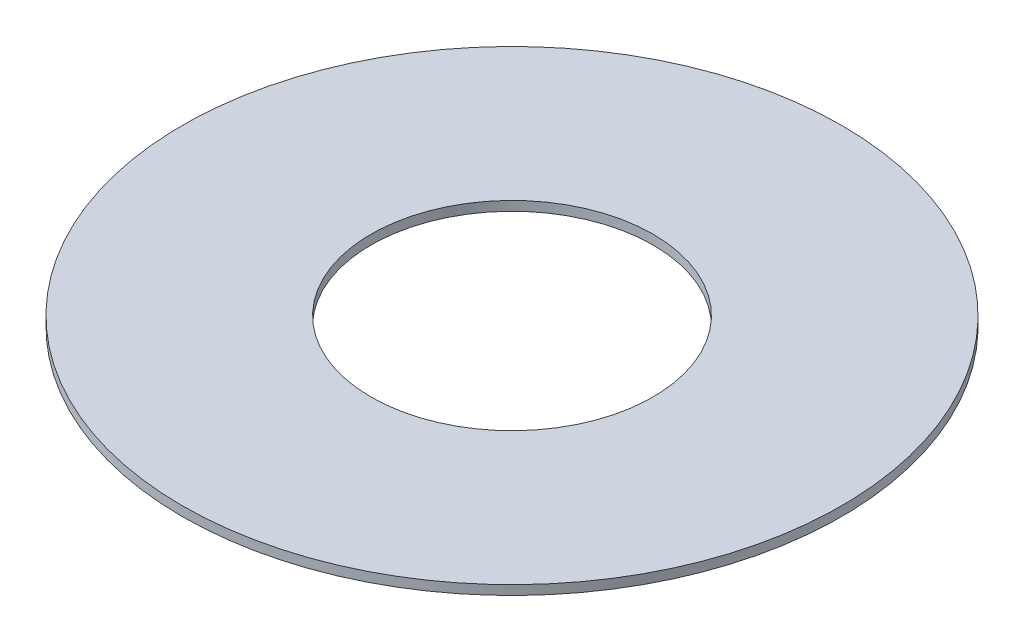
ISO-10303-21;
HEADER;
FILE_DESCRIPTION(('STEP AP214'),'2;1');
FILE_NAME('part.step','',(''),(''),'','','');
FILE_SCHEMA(('AUTOMOTIVE_DESIGN { 1 0 10303 214 1 1 1 1 }'));
ENDSEC;
DATA;
#1=APPLICATION_CONTEXT('core data for automotive mechanical design processes');
#2=APPLICATION_PROTOCOL_DEFINITION('international standard','automotive_design',2000,#1);
#3=PRODUCT_CONTEXT('',#1,'mechanical');
#4=PRODUCT('Part','Part','',(#3));
#5=PRODUCT_RELATED_PRODUCT_CATEGORY('part','',(#4));
#6=PRODUCT_DEFINITION_FORMATION('','',#4);
#7=PRODUCT_DEFINITION_CONTEXT('part definition',#1,'design');
#8=PRODUCT_DEFINITION('design','',#6,#7);
#9=PRODUCT_DEFINITION_SHAPE('','',#8);
#10=(LENGTH_UNIT() NAMED_UNIT(*) SI_UNIT(.MILLI.,.METRE.));
#11=(NAMED_UNIT(*) PLANE_ANGLE_UNIT() SI_UNIT($,.RADIAN.));
#12=(NAMED_UNIT(*) SI_UNIT($,.STERADIAN.) SOLID_ANGLE_UNIT());
#13=UNCERTAINTY_MEASURE_WITH_UNIT(LENGTH_MEASURE(1.E-05),#10,'distance_accuracy_value','');
#14=(GEOMETRIC_REPRESENTATION_CONTEXT(3) GLOBAL_UNCERTAINTY_ASSIGNED_CONTEXT((#13)) GLOBAL_UNIT_ASSIGNED_CONTEXT((#10,
#11,#12)) REPRESENTATION_CONTEXT('',''));
#15=CARTESIAN_POINT('',(0.,0.,0.));
#16=DIRECTION('',(0.,0.,1.));
#17=DIRECTION('',(1.,0.,0.));
#18=AXIS2_PLACEMENT_3D('',#15,#16,#17);
#19=CARTESIAN_POINT('',(0.,0.1,0.));
#20=DIRECTION('',(0.,1.,0.));
#21=DIRECTION('',(0.,0.,1.));
#22=AXIS2_PLACEMENT_3D('',#19,#20,#21);
#23=PLANE('',#22);
#24=CARTESIAN_POINT('',(0.,0.1,0.));
#25=DIRECTION('',(0.,1.,0.));
#26=DIRECTION('',(0.,0.,1.));
#27=AXIS2_PLACEMENT_3D('',#24,#25,#26);
#28=CIRCLE('',#27,3.505);
#29=CARTESIAN_POINT('',(0.,0.1,3.505));
#30=VERTEX_POINT('',#29);
#31=EDGE_CURVE('E10',#30,#30,#28,.T.);
#32=ORIENTED_EDGE('',*,*,#31,.T.);
#33=EDGE_LOOP('',(#32));
#34=FACE_BOUND('',#33,.T.);
#35=CARTESIAN_POINT('',(0.,0.1,0.));
#36=DIRECTION('',(0.,1.,0.));
#37=DIRECTION('',(0.,0.,1.));
#38=AXIS2_PLACEMENT_3D('',#35,#36,#37);
#39=CIRCLE('',#38,1.5);
#40=CARTESIAN_POINT('',(0.,0.1,1.5));
#41=VERTEX_POINT('',#40);
#42=EDGE_CURVE('E44',#41,#41,#39,.T.);
#43=ORIENTED_EDGE('',*,*,#42,.F.);
#44=EDGE_LOOP('',(#43));
#45=FACE_BOUND('',#44,.T.);
#46=ADVANCED_FACE('F33',(#34,#45),#23,.T.);
#47=CARTESIAN_POINT('',(0.,0.,0.));
#48=DIRECTION('',(0.,1.,0.));
#49=DIRECTION('',(0.,0.,1.));
#50=AXIS2_PLACEMENT_3D('',#47,#48,#49);
#51=PLANE('',#50);
#52=CARTESIAN_POINT('',(0.,0.,0.));
#53=DIRECTION('',(0.,1.,0.));
#54=DIRECTION('',(0.,0.,1.));
#55=AXIS2_PLACEMENT_3D('',#52,#53,#54);
#56=CIRCLE('',#55,3.505);
#57=CARTESIAN_POINT('',(0.,0.,3.505));
#58=VERTEX_POINT('',#57);
#59=EDGE_CURVE('E37',#58,#58,#56,.T.);
#60=ORIENTED_EDGE('',*,*,#59,.F.);
#61=EDGE_LOOP('',(#60));
#62=FACE_BOUND('',#61,.T.);
#63=CARTESIAN_POINT('',(0.,0.,0.));
#64=DIRECTION('',(0.,1.,0.));
#65=DIRECTION('',(0.,0.,1.));
#66=AXIS2_PLACEMENT_3D('',#63,#64,#65);
#67=CIRCLE('',#66,1.5);
#68=CARTESIAN_POINT('',(0.,0.,1.5));
#69=VERTEX_POINT('',#68);
#70=EDGE_CURVE('E46',#69,#69,#67,.T.);
#71=ORIENTED_EDGE('',*,*,#70,.T.);
#72=EDGE_LOOP('',(#71));
#73=FACE_BOUND('',#72,.T.);
#74=ADVANCED_FACE('F56',(#62,#73),#51,.F.);
#75=CARTESIAN_POINT('',(0.,0.1,0.));
#76=DIRECTION('',(0.,-1.,0.));
#77=DIRECTION('',(0.,0.,-1.));
#78=AXIS2_PLACEMENT_3D('',#75,#76,#77);
#79=CYLINDRICAL_SURFACE('',#78,3.505);
#80=ORIENTED_EDGE('',*,*,#31,.F.);
#81=EDGE_LOOP('',(#80));
#82=FACE_BOUND('',#81,.T.);
#83=ORIENTED_EDGE('',*,*,#59,.T.);
#84=EDGE_LOOP('',(#83));
#85=FACE_BOUND('',#84,.T.);
#86=ADVANCED_FACE('F35',(#82,#85),#79,.T.);
#87=CARTESIAN_POINT('',(0.,0.1,0.));
#88=DIRECTION('',(0.,-1.,0.));
#89=DIRECTION('',(0.,0.,-1.));
#90=AXIS2_PLACEMENT_3D('',#87,#88,#89);
#91=CYLINDRICAL_SURFACE('',#90,1.5);
#92=ORIENTED_EDGE('',*,*,#42,.T.);
#93=EDGE_LOOP('',(#92));
#94=FACE_BOUND('',#93,.T.);
#95=ORIENTED_EDGE('',*,*,#70,.F.);
#96=EDGE_LOOP('',(#95));
#97=FACE_BOUND('',#96,.T.);
#98=ADVANCED_FACE('F52',(#94,#97),#91,.F.);
#99=CLOSED_SHELL('',(#46,#74,#86,#98));
#100=MANIFOLD_SOLID_BREP('B2',#99);
#101=ADVANCED_BREP_SHAPE_REPRESENTATION('',(#18,#100),#14);
#102=SHAPE_DEFINITION_REPRESENTATION(#9,#101);
ENDSEC;
END-ISO-10303-21;
